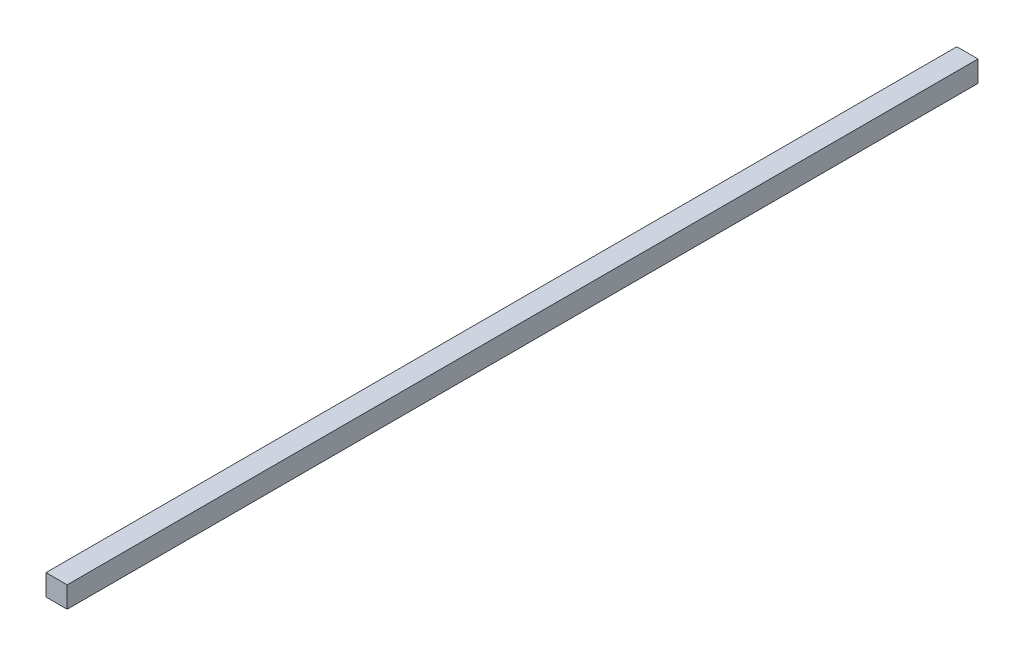
ISO-10303-21;
HEADER;
FILE_DESCRIPTION(('STEP AP214'),'2;1');
FILE_NAME('part.step','',(''),(''),'','','');
FILE_SCHEMA(('AUTOMOTIVE_DESIGN { 1 0 10303 214 1 1 1 1 }'));
ENDSEC;
DATA;
#1=APPLICATION_CONTEXT('core data for automotive mechanical design processes');
#2=APPLICATION_PROTOCOL_DEFINITION('international standard','automotive_design',2000,#1);
#3=PRODUCT_CONTEXT('',#1,'mechanical');
#4=PRODUCT('Part','Part','',(#3));
#5=PRODUCT_RELATED_PRODUCT_CATEGORY('part','',(#4));
#6=PRODUCT_DEFINITION_FORMATION('','',#4);
#7=PRODUCT_DEFINITION_CONTEXT('part definition',#1,'design');
#8=PRODUCT_DEFINITION('design','',#6,#7);
#9=PRODUCT_DEFINITION_SHAPE('','',#8);
#10=(LENGTH_UNIT() NAMED_UNIT(*) SI_UNIT(.MILLI.,.METRE.));
#11=(NAMED_UNIT(*) PLANE_ANGLE_UNIT() SI_UNIT($,.RADIAN.));
#12=(NAMED_UNIT(*) SI_UNIT($,.STERADIAN.) SOLID_ANGLE_UNIT());
#13=UNCERTAINTY_MEASURE_WITH_UNIT(LENGTH_MEASURE(1.E-05),#10,'distance_accuracy_value','');
#14=(GEOMETRIC_REPRESENTATION_CONTEXT(3) GLOBAL_UNCERTAINTY_ASSIGNED_CONTEXT((#13)) GLOBAL_UNIT_ASSIGNED_CONTEXT((#10,
#11,#12)) REPRESENTATION_CONTEXT('',''));
#15=CARTESIAN_POINT('',(0.,0.,0.));
#16=DIRECTION('',(0.,0.,1.));
#17=DIRECTION('',(1.,0.,0.));
#18=AXIS2_PLACEMENT_3D('',#15,#16,#17);
#19=CARTESIAN_POINT('',(10.,-10.,860.));
#20=DIRECTION('',(-1.,0.,0.));
#21=DIRECTION('',(0.,0.,1.));
#22=AXIS2_PLACEMENT_3D('',#19,#20,#21);
#23=PLANE('',#22);
#24=DIRECTION('',(0.,1.,0.));
#25=VECTOR('',#24,1.);
#26=CARTESIAN_POINT('',(10.,-10.,0.));
#27=LINE('',#26,#25);
#28=CARTESIAN_POINT('',(10.,-10.,0.));
#29=VERTEX_POINT('',#28);
#30=CARTESIAN_POINT('',(10.,10.,0.));
#31=VERTEX_POINT('',#30);
#32=EDGE_CURVE('E96',#29,#31,#27,.T.);
#33=ORIENTED_EDGE('',*,*,#32,.T.);
#34=DIRECTION('',(0.,0.,-1.));
#35=VECTOR('',#34,1.);
#36=CARTESIAN_POINT('',(10.,10.,860.));
#37=LINE('',#36,#35);
#38=CARTESIAN_POINT('',(10.,10.,860.));
#39=VERTEX_POINT('',#38);
#40=EDGE_CURVE('E11',#39,#31,#37,.T.);
#41=ORIENTED_EDGE('',*,*,#40,.F.);
#42=DIRECTION('',(0.,1.,0.));
#43=VECTOR('',#42,1.);
#44=CARTESIAN_POINT('',(10.,-10.,860.));
#45=LINE('',#44,#43);
#46=CARTESIAN_POINT('',(10.,-10.,860.));
#47=VERTEX_POINT('',#46);
#48=EDGE_CURVE('E84',#47,#39,#45,.T.);
#49=ORIENTED_EDGE('',*,*,#48,.F.);
#50=DIRECTION('',(0.,0.,-1.));
#51=VECTOR('',#50,1.);
#52=CARTESIAN_POINT('',(10.,-10.,860.));
#53=LINE('',#52,#51);
#54=EDGE_CURVE('E92',#47,#29,#53,.T.);
#55=ORIENTED_EDGE('',*,*,#54,.T.);
#56=EDGE_LOOP('',(#33,#41,#49,#55));
#57=FACE_BOUND('',#56,.T.);
#58=ADVANCED_FACE('F33',(#57),#23,.F.);
#59=CARTESIAN_POINT('',(-10.,10.,860.));
#60=DIRECTION('',(0.,-1.,0.));
#61=DIRECTION('',(0.,0.,-1.));
#62=AXIS2_PLACEMENT_3D('',#59,#60,#61);
#63=PLANE('',#62);
#64=DIRECTION('',(-1.,0.,0.));
#65=VECTOR('',#64,1.);
#66=CARTESIAN_POINT('',(-10.,10.,0.));
#67=LINE('',#66,#65);
#68=CARTESIAN_POINT('',(-10.,10.,0.));
#69=VERTEX_POINT('',#68);
#70=EDGE_CURVE('E88',#31,#69,#67,.T.);
#71=ORIENTED_EDGE('',*,*,#70,.T.);
#72=DIRECTION('',(0.,0.,-1.));
#73=VECTOR('',#72,1.);
#74=CARTESIAN_POINT('',(-10.,10.,860.));
#75=LINE('',#74,#73);
#76=CARTESIAN_POINT('',(-10.,10.,860.));
#77=VERTEX_POINT('',#76);
#78=EDGE_CURVE('E41',#77,#69,#75,.T.);
#79=ORIENTED_EDGE('',*,*,#78,.F.);
#80=DIRECTION('',(-1.,0.,0.));
#81=VECTOR('',#80,1.);
#82=CARTESIAN_POINT('',(-10.,10.,860.));
#83=LINE('',#82,#81);
#84=EDGE_CURVE('E79',#39,#77,#83,.T.);
#85=ORIENTED_EDGE('',*,*,#84,.F.);
#86=ORIENTED_EDGE('',*,*,#40,.T.);
#87=EDGE_LOOP('',(#71,#79,#85,#86));
#88=FACE_BOUND('',#87,.T.);
#89=ADVANCED_FACE('F87',(#88),#63,.F.);
#90=CARTESIAN_POINT('',(-10.,-10.,860.));
#91=DIRECTION('',(1.,0.,0.));
#92=DIRECTION('',(0.,0.,-1.));
#93=AXIS2_PLACEMENT_3D('',#90,#91,#92);
#94=PLANE('',#93);
#95=DIRECTION('',(0.,-1.,0.));
#96=VECTOR('',#95,1.);
#97=CARTESIAN_POINT('',(-10.,-10.,0.));
#98=LINE('',#97,#96);
#99=CARTESIAN_POINT('',(-10.,-10.,0.));
#100=VERTEX_POINT('',#99);
#101=EDGE_CURVE('E66',#69,#100,#98,.T.);
#102=ORIENTED_EDGE('',*,*,#101,.T.);
#103=DIRECTION('',(0.,0.,-1.));
#104=VECTOR('',#103,1.);
#105=CARTESIAN_POINT('',(-10.,-10.,860.));
#106=LINE('',#105,#104);
#107=CARTESIAN_POINT('',(-10.,-10.,860.));
#108=VERTEX_POINT('',#107);
#109=EDGE_CURVE('E89',#108,#100,#106,.T.);
#110=ORIENTED_EDGE('',*,*,#109,.F.);
#111=DIRECTION('',(0.,-1.,0.));
#112=VECTOR('',#111,1.);
#113=CARTESIAN_POINT('',(-10.,-10.,860.));
#114=LINE('',#113,#112);
#115=EDGE_CURVE('E82',#77,#108,#114,.T.);
#116=ORIENTED_EDGE('',*,*,#115,.F.);
#117=ORIENTED_EDGE('',*,*,#78,.T.);
#118=EDGE_LOOP('',(#102,#110,#116,#117));
#119=FACE_BOUND('',#118,.T.);
#120=ADVANCED_FACE('F90',(#119),#94,.F.);
#121=CARTESIAN_POINT('',(-10.,-10.,860.));
#122=DIRECTION('',(0.,1.,0.));
#123=DIRECTION('',(0.,0.,1.));
#124=AXIS2_PLACEMENT_3D('',#121,#122,#123);
#125=PLANE('',#124);
#126=DIRECTION('',(1.,0.,0.));
#127=VECTOR('',#126,1.);
#128=CARTESIAN_POINT('',(-10.,-10.,0.));
#129=LINE('',#128,#127);
#130=EDGE_CURVE('E72',#100,#29,#129,.T.);
#131=ORIENTED_EDGE('',*,*,#130,.T.);
#132=ORIENTED_EDGE('',*,*,#54,.F.);
#133=DIRECTION('',(1.,0.,0.));
#134=VECTOR('',#133,1.);
#135=CARTESIAN_POINT('',(-10.,-10.,860.));
#136=LINE('',#135,#134);
#137=EDGE_CURVE('E49',#108,#47,#136,.T.);
#138=ORIENTED_EDGE('',*,*,#137,.F.);
#139=ORIENTED_EDGE('',*,*,#109,.T.);
#140=EDGE_LOOP('',(#131,#132,#138,#139));
#141=FACE_BOUND('',#140,.T.);
#142=ADVANCED_FACE('F103',(#141),#125,.F.);
#143=CARTESIAN_POINT('',(0.,0.,860.));
#144=DIRECTION('',(0.,0.,-1.));
#145=DIRECTION('',(-1.,0.,0.));
#146=AXIS2_PLACEMENT_3D('',#143,#144,#145);
#147=PLANE('',#146);
#148=ORIENTED_EDGE('',*,*,#48,.T.);
#149=ORIENTED_EDGE('',*,*,#84,.T.);
#150=ORIENTED_EDGE('',*,*,#115,.T.);
#151=ORIENTED_EDGE('',*,*,#137,.T.);
#152=EDGE_LOOP('',(#148,#149,#150,#151));
#153=FACE_BOUND('',#152,.T.);
#154=ADVANCED_FACE('F80',(#153),#147,.F.);
#155=CARTESIAN_POINT('',(0.,0.,0.));
#156=DIRECTION('',(0.,0.,-1.));
#157=DIRECTION('',(-1.,0.,0.));
#158=AXIS2_PLACEMENT_3D('',#155,#156,#157);
#159=PLANE('',#158);
#160=ORIENTED_EDGE('',*,*,#32,.F.);
#161=ORIENTED_EDGE('',*,*,#130,.F.);
#162=ORIENTED_EDGE('',*,*,#101,.F.);
#163=ORIENTED_EDGE('',*,*,#70,.F.);
#164=EDGE_LOOP('',(#160,#161,#162,#163));
#165=FACE_BOUND('',#164,.T.);
#166=ADVANCED_FACE('F106',(#165),#159,.T.);
#167=CLOSED_SHELL('',(#58,#89,#120,#142,#154,#166));
#168=MANIFOLD_SOLID_BREP('B2',#167);
#169=ADVANCED_BREP_SHAPE_REPRESENTATION('',(#18,#168),#14);
#170=SHAPE_DEFINITION_REPRESENTATION(#9,#169);
ENDSEC;
END-ISO-10303-21;
